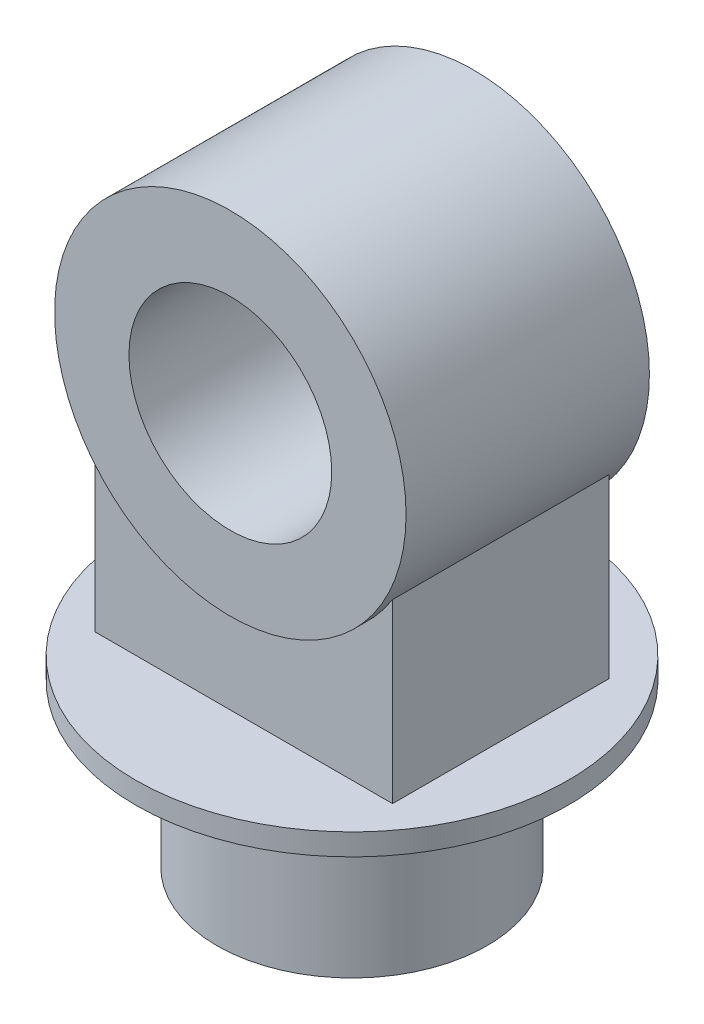
ISO-10303-21;
HEADER;
FILE_DESCRIPTION(('STEP AP214'),'2;1');
FILE_NAME('part.step','',(''),(''),'','','');
FILE_SCHEMA(('AUTOMOTIVE_DESIGN { 1 0 10303 214 1 1 1 1 }'));
ENDSEC;
DATA;
#1=APPLICATION_CONTEXT('core data for automotive mechanical design processes');
#2=APPLICATION_PROTOCOL_DEFINITION('international standard','automotive_design',2000,#1);
#3=PRODUCT_CONTEXT('',#1,'mechanical');
#4=PRODUCT('Part','Part','',(#3));
#5=PRODUCT_RELATED_PRODUCT_CATEGORY('part','',(#4));
#6=PRODUCT_DEFINITION_FORMATION('','',#4);
#7=PRODUCT_DEFINITION_CONTEXT('part definition',#1,'design');
#8=PRODUCT_DEFINITION('design','',#6,#7);
#9=PRODUCT_DEFINITION_SHAPE('','',#8);
#10=(LENGTH_UNIT() NAMED_UNIT(*) SI_UNIT(.MILLI.,.METRE.));
#11=(NAMED_UNIT(*) PLANE_ANGLE_UNIT() SI_UNIT($,.RADIAN.));
#12=(NAMED_UNIT(*) SI_UNIT($,.STERADIAN.) SOLID_ANGLE_UNIT());
#13=UNCERTAINTY_MEASURE_WITH_UNIT(LENGTH_MEASURE(1.E-05),#10,'distance_accuracy_value','');
#14=(GEOMETRIC_REPRESENTATION_CONTEXT(3) GLOBAL_UNCERTAINTY_ASSIGNED_CONTEXT((#13)) GLOBAL_UNIT_ASSIGNED_CONTEXT((#10,
#11,#12)) REPRESENTATION_CONTEXT('',''));
#15=CARTESIAN_POINT('',(0.,0.,0.));
#16=DIRECTION('',(0.,0.,1.));
#17=DIRECTION('',(1.,0.,0.));
#18=AXIS2_PLACEMENT_3D('',#15,#16,#17);
#19=CARTESIAN_POINT('',(0.,120.,0.));
#20=DIRECTION('',(0.,-1.,0.));
#21=DIRECTION('',(0.,0.,-1.));
#22=AXIS2_PLACEMENT_3D('',#19,#20,#21);
#23=CYLINDRICAL_SURFACE('',#22,100.);
#24=CARTESIAN_POINT('',(0.,120.,0.));
#25=DIRECTION('',(0.,1.,0.));
#26=DIRECTION('',(0.,0.,1.));
#27=AXIS2_PLACEMENT_3D('',#24,#25,#26);
#28=CIRCLE('',#27,100.);
#29=CARTESIAN_POINT('',(0.,120.,100.));
#30=VERTEX_POINT('',#29);
#31=EDGE_CURVE('E11',#30,#30,#28,.T.);
#32=ORIENTED_EDGE('',*,*,#31,.F.);
#33=EDGE_LOOP('',(#32));
#34=FACE_BOUND('',#33,.T.);
#35=CARTESIAN_POINT('',(0.,0.,0.));
#36=DIRECTION('',(0.,1.,0.));
#37=DIRECTION('',(0.,0.,1.));
#38=AXIS2_PLACEMENT_3D('',#35,#36,#37);
#39=CIRCLE('',#38,100.);
#40=CARTESIAN_POINT('',(0.,0.,100.));
#41=VERTEX_POINT('',#40);
#42=EDGE_CURVE('E46',#41,#41,#39,.T.);
#43=ORIENTED_EDGE('',*,*,#42,.T.);
#44=EDGE_LOOP('',(#43));
#45=FACE_BOUND('',#44,.T.);
#46=ADVANCED_FACE('F43',(#34,#45),#23,.T.);
#47=CARTESIAN_POINT('',(0.,0.,0.));
#48=DIRECTION('',(0.,1.,0.));
#49=DIRECTION('',(0.,0.,1.));
#50=AXIS2_PLACEMENT_3D('',#47,#48,#49);
#51=PLANE('',#50);
#52=ORIENTED_EDGE('',*,*,#42,.F.);
#53=EDGE_LOOP('',(#52));
#54=FACE_BOUND('',#53,.T.);
#55=ADVANCED_FACE('F147',(#54),#51,.F.);
#56=CARTESIAN_POINT('',(0.,136.,0.));
#57=DIRECTION('',(0.,-1.,0.));
#58=DIRECTION('',(0.,0.,-1.));
#59=AXIS2_PLACEMENT_3D('',#56,#57,#58);
#60=CYLINDRICAL_SURFACE('',#59,160.);
#61=CARTESIAN_POINT('',(0.,136.,0.));
#62=DIRECTION('',(0.,1.,0.));
#63=DIRECTION('',(0.,0.,1.));
#64=AXIS2_PLACEMENT_3D('',#61,#62,#63);
#65=CIRCLE('',#64,160.);
#66=CARTESIAN_POINT('',(0.,136.,160.));
#67=VERTEX_POINT('',#66);
#68=EDGE_CURVE('E111',#67,#67,#65,.T.);
#69=ORIENTED_EDGE('',*,*,#68,.F.);
#70=EDGE_LOOP('',(#69));
#71=FACE_BOUND('',#70,.T.);
#72=CARTESIAN_POINT('',(0.,120.,0.));
#73=DIRECTION('',(0.,1.,0.));
#74=DIRECTION('',(0.,0.,1.));
#75=AXIS2_PLACEMENT_3D('',#72,#73,#74);
#76=CIRCLE('',#75,160.);
#77=CARTESIAN_POINT('',(0.,120.,160.));
#78=VERTEX_POINT('',#77);
#79=EDGE_CURVE('E114',#78,#78,#76,.T.);
#80=ORIENTED_EDGE('',*,*,#79,.T.);
#81=EDGE_LOOP('',(#80));
#82=FACE_BOUND('',#81,.T.);
#83=ADVANCED_FACE('F142',(#71,#82),#60,.T.);
#84=CARTESIAN_POINT('',(0.,136.,0.));
#85=DIRECTION('',(0.,1.,0.));
#86=DIRECTION('',(0.,0.,1.));
#87=AXIS2_PLACEMENT_3D('',#84,#85,#86);
#88=PLANE('',#87);
#89=DIRECTION('',(0.,0.,-1.));
#90=VECTOR('',#89,1.);
#91=CARTESIAN_POINT('',(110.,136.,-80.));
#92=LINE('',#91,#90);
#93=CARTESIAN_POINT('',(110.,136.,80.));
#94=VERTEX_POINT('',#93);
#95=CARTESIAN_POINT('',(110.,136.,-80.));
#96=VERTEX_POINT('',#95);
#97=EDGE_CURVE('E57',#94,#96,#92,.T.);
#98=ORIENTED_EDGE('',*,*,#97,.F.);
#99=DIRECTION('',(1.,0.,0.));
#100=VECTOR('',#99,1.);
#101=CARTESIAN_POINT('',(-110.,136.,80.));
#102=LINE('',#101,#100);
#103=CARTESIAN_POINT('',(-110.,136.,80.));
#104=VERTEX_POINT('',#103);
#105=EDGE_CURVE('E62',#104,#94,#102,.T.);
#106=ORIENTED_EDGE('',*,*,#105,.F.);
#107=DIRECTION('',(0.,0.,1.));
#108=VECTOR('',#107,1.);
#109=CARTESIAN_POINT('',(-110.,136.,-80.));
#110=LINE('',#109,#108);
#111=CARTESIAN_POINT('',(-110.,136.,-80.));
#112=VERTEX_POINT('',#111);
#113=EDGE_CURVE('E119',#112,#104,#110,.T.);
#114=ORIENTED_EDGE('',*,*,#113,.F.);
#115=DIRECTION('',(-1.,0.,0.));
#116=VECTOR('',#115,1.);
#117=CARTESIAN_POINT('',(-110.,136.,-80.));
#118=LINE('',#117,#116);
#119=EDGE_CURVE('E87',#96,#112,#118,.T.);
#120=ORIENTED_EDGE('',*,*,#119,.F.);
#121=EDGE_LOOP('',(#98,#106,#114,#120));
#122=FACE_BOUND('',#121,.T.);
#123=ORIENTED_EDGE('',*,*,#68,.T.);
#124=EDGE_LOOP('',(#123));
#125=FACE_BOUND('',#124,.T.);
#126=ADVANCED_FACE('F138',(#122,#125),#88,.T.);
#127=CARTESIAN_POINT('',(0.,120.,0.));
#128=DIRECTION('',(0.,1.,0.));
#129=DIRECTION('',(0.,0.,1.));
#130=AXIS2_PLACEMENT_3D('',#127,#128,#129);
#131=PLANE('',#130);
#132=ORIENTED_EDGE('',*,*,#31,.T.);
#133=EDGE_LOOP('',(#132));
#134=FACE_BOUND('',#133,.T.);
#135=ORIENTED_EDGE('',*,*,#79,.F.);
#136=EDGE_LOOP('',(#135));
#137=FACE_BOUND('',#136,.T.);
#138=ADVANCED_FACE('F141',(#134,#137),#131,.F.);
#139=CARTESIAN_POINT('',(-110.,466.002,-80.));
#140=DIRECTION('',(0.,0.,1.));
#141=DIRECTION('',(1.,0.,0.));
#142=AXIS2_PLACEMENT_3D('',#139,#140,#141);
#143=PLANE('',#142);
#144=CARTESIAN_POINT('',(0.,336.,-80.));
#145=DIRECTION('',(0.,0.,1.));
#146=DIRECTION('',(1.,0.,0.));
#147=AXIS2_PLACEMENT_3D('',#144,#145,#146);
#148=CIRCLE('',#147,130.);
#149=CARTESIAN_POINT('',(110.,266.717967697245,-80.));
#150=VERTEX_POINT('',#149);
#151=CARTESIAN_POINT('',(-110.,266.717967697245,-80.));
#152=VERTEX_POINT('',#151);
#153=EDGE_CURVE('E98',#150,#152,#148,.F.);
#154=ORIENTED_EDGE('',*,*,#153,.F.);
#155=DIRECTION('',(0.,-1.,0.));
#156=VECTOR('',#155,1.);
#157=CARTESIAN_POINT('',(110.,466.002,-80.));
#158=LINE('',#157,#156);
#159=EDGE_CURVE('E95',#150,#96,#158,.T.);
#160=ORIENTED_EDGE('',*,*,#159,.T.);
#161=ORIENTED_EDGE('',*,*,#119,.T.);
#162=DIRECTION('',(0.,-1.,0.));
#163=VECTOR('',#162,1.);
#164=CARTESIAN_POINT('',(-110.,466.002,-80.));
#165=LINE('',#164,#163);
#166=EDGE_CURVE('E130',#152,#112,#165,.T.);
#167=ORIENTED_EDGE('',*,*,#166,.F.);
#168=EDGE_LOOP('',(#154,#160,#161,#167));
#169=FACE_BOUND('',#168,.T.);
#170=ADVANCED_FACE('F135',(#169),#143,.F.);
#171=CARTESIAN_POINT('',(110.,466.002,-80.));
#172=DIRECTION('',(-1.,0.,0.));
#173=DIRECTION('',(0.,0.,1.));
#174=AXIS2_PLACEMENT_3D('',#171,#172,#173);
#175=PLANE('',#174);
#176=DIRECTION('',(0.,0.,-1.));
#177=VECTOR('',#176,1.);
#178=CARTESIAN_POINT('',(110.,266.717967697245,90.));
#179=LINE('',#178,#177);
#180=CARTESIAN_POINT('',(110.,266.717967697245,80.));
#181=VERTEX_POINT('',#180);
#182=EDGE_CURVE('E92',#181,#150,#179,.T.);
#183=ORIENTED_EDGE('',*,*,#182,.F.);
#184=DIRECTION('',(0.,-1.,0.));
#185=VECTOR('',#184,1.);
#186=CARTESIAN_POINT('',(110.,466.002,80.));
#187=LINE('',#186,#185);
#188=EDGE_CURVE('E80',#181,#94,#187,.T.);
#189=ORIENTED_EDGE('',*,*,#188,.T.);
#190=ORIENTED_EDGE('',*,*,#97,.T.);
#191=ORIENTED_EDGE('',*,*,#159,.F.);
#192=EDGE_LOOP('',(#183,#189,#190,#191));
#193=FACE_BOUND('',#192,.T.);
#194=ADVANCED_FACE('F93',(#193),#175,.F.);
#195=CARTESIAN_POINT('',(-110.,466.002,-80.));
#196=DIRECTION('',(1.,0.,0.));
#197=DIRECTION('',(0.,0.,-1.));
#198=AXIS2_PLACEMENT_3D('',#195,#196,#197);
#199=PLANE('',#198);
#200=DIRECTION('',(0.,0.,-1.));
#201=VECTOR('',#200,1.);
#202=CARTESIAN_POINT('',(-110.,266.717967697245,90.));
#203=LINE('',#202,#201);
#204=CARTESIAN_POINT('',(-110.,266.717967697245,80.));
#205=VERTEX_POINT('',#204);
#206=EDGE_CURVE('E102',#152,#205,#203,.F.);
#207=ORIENTED_EDGE('',*,*,#206,.F.);
#208=ORIENTED_EDGE('',*,*,#166,.T.);
#209=ORIENTED_EDGE('',*,*,#113,.T.);
#210=DIRECTION('',(0.,-1.,0.));
#211=VECTOR('',#210,1.);
#212=CARTESIAN_POINT('',(-110.,466.002,80.));
#213=LINE('',#212,#211);
#214=EDGE_CURVE('E88',#205,#104,#213,.T.);
#215=ORIENTED_EDGE('',*,*,#214,.F.);
#216=EDGE_LOOP('',(#207,#208,#209,#215));
#217=FACE_BOUND('',#216,.T.);
#218=ADVANCED_FACE('F137',(#217),#199,.F.);
#219=CARTESIAN_POINT('',(-110.,466.002,80.));
#220=DIRECTION('',(0.,0.,-1.));
#221=DIRECTION('',(-1.,0.,0.));
#222=AXIS2_PLACEMENT_3D('',#219,#220,#221);
#223=PLANE('',#222);
#224=CARTESIAN_POINT('',(0.,336.,80.));
#225=DIRECTION('',(0.,0.,-1.));
#226=DIRECTION('',(-1.,0.,0.));
#227=AXIS2_PLACEMENT_3D('',#224,#225,#226);
#228=CIRCLE('',#227,130.);
#229=EDGE_CURVE('E84',#205,#181,#228,.F.);
#230=ORIENTED_EDGE('',*,*,#229,.F.);
#231=ORIENTED_EDGE('',*,*,#214,.T.);
#232=ORIENTED_EDGE('',*,*,#105,.T.);
#233=ORIENTED_EDGE('',*,*,#188,.F.);
#234=EDGE_LOOP('',(#230,#231,#232,#233));
#235=FACE_BOUND('',#234,.T.);
#236=ADVANCED_FACE('F82',(#235),#223,.F.);
#237=CARTESIAN_POINT('',(0.,336.,90.));
#238=DIRECTION('',(0.,0.,-1.));
#239=DIRECTION('',(-1.,0.,0.));
#240=AXIS2_PLACEMENT_3D('',#237,#238,#239);
#241=CYLINDRICAL_SURFACE('',#240,130.);
#242=CARTESIAN_POINT('',(0.,336.,90.));
#243=DIRECTION('',(0.,0.,1.));
#244=DIRECTION('',(1.,0.,0.));
#245=AXIS2_PLACEMENT_3D('',#242,#243,#244);
#246=CIRCLE('',#245,130.);
#247=CARTESIAN_POINT('',(130.,336.,90.));
#248=VERTEX_POINT('',#247);
#249=EDGE_CURVE('E107',#248,#248,#246,.T.);
#250=ORIENTED_EDGE('',*,*,#249,.F.);
#251=EDGE_LOOP('',(#250));
#252=FACE_BOUND('',#251,.T.);
#253=CARTESIAN_POINT('',(0.,336.,-90.));
#254=DIRECTION('',(0.,0.,1.));
#255=DIRECTION('',(1.,0.,0.));
#256=AXIS2_PLACEMENT_3D('',#253,#254,#255);
#257=CIRCLE('',#256,130.);
#258=CARTESIAN_POINT('',(130.,336.,-90.));
#259=VERTEX_POINT('',#258);
#260=EDGE_CURVE('E200',#259,#259,#257,.T.);
#261=ORIENTED_EDGE('',*,*,#260,.T.);
#262=EDGE_LOOP('',(#261));
#263=FACE_BOUND('',#262,.T.);
#264=ORIENTED_EDGE('',*,*,#182,.T.);
#265=ORIENTED_EDGE('',*,*,#153,.T.);
#266=ORIENTED_EDGE('',*,*,#206,.T.);
#267=ORIENTED_EDGE('',*,*,#229,.T.);
#268=EDGE_LOOP('',(#264,#265,#266,#267));
#269=FACE_BOUND('',#268,.T.);
#270=ADVANCED_FACE('F101',(#252,#263,#269),#241,.T.);
#271=CARTESIAN_POINT('',(0.,336.,90.));
#272=DIRECTION('',(0.,0.,-1.));
#273=DIRECTION('',(-1.,0.,0.));
#274=AXIS2_PLACEMENT_3D('',#271,#272,#273);
#275=CYLINDRICAL_SURFACE('',#274,75.);
#276=CARTESIAN_POINT('',(0.,336.,90.));
#277=DIRECTION('',(0.,0.,1.));
#278=DIRECTION('',(1.,0.,0.));
#279=AXIS2_PLACEMENT_3D('',#276,#277,#278);
#280=CIRCLE('',#279,75.);
#281=CARTESIAN_POINT('',(-75.,336.,90.));
#282=VERTEX_POINT('',#281);
#283=EDGE_CURVE('E103',#282,#282,#280,.T.);
#284=CARTESIAN_POINT('',(0.,336.,-90.));
#285=DIRECTION('',(0.,0.,1.));
#286=DIRECTION('',(1.,0.,0.));
#287=AXIS2_PLACEMENT_3D('',#284,#285,#286);
#288=CIRCLE('',#287,75.);
#289=CARTESIAN_POINT('',(-75.,336.,-90.));
#290=VERTEX_POINT('',#289);
#291=EDGE_CURVE('E123',#290,#290,#288,.T.);
#292=CARTESIAN_POINT('',(-75.,336.,90.));
#293=CARTESIAN_POINT('',(-75.,336.,88.125));
#294=CARTESIAN_POINT('',(-75.,336.,86.25));
#295=CARTESIAN_POINT('',(-75.,336.,82.5));
#296=CARTESIAN_POINT('',(-75.,336.,80.625));
#297=CARTESIAN_POINT('',(-75.,336.,76.875));
#298=CARTESIAN_POINT('',(-75.,336.,75.));
#299=CARTESIAN_POINT('',(-75.,336.,71.25));
#300=CARTESIAN_POINT('',(-75.,336.,69.375));
#301=CARTESIAN_POINT('',(-75.,336.,65.625));
#302=CARTESIAN_POINT('',(-75.,336.,63.75));
#303=CARTESIAN_POINT('',(-75.,336.,60.));
#304=CARTESIAN_POINT('',(-75.,336.,58.125));
#305=CARTESIAN_POINT('',(-75.,336.,54.375));
#306=CARTESIAN_POINT('',(-75.,336.,52.5));
#307=CARTESIAN_POINT('',(-75.,336.,48.75));
#308=CARTESIAN_POINT('',(-75.,336.,46.875));
#309=CARTESIAN_POINT('',(-75.,336.,43.125));
#310=CARTESIAN_POINT('',(-75.,336.,41.25));
#311=CARTESIAN_POINT('',(-75.,336.,37.5));
#312=CARTESIAN_POINT('',(-75.,336.,35.625));
#313=CARTESIAN_POINT('',(-75.,336.,31.875));
#314=CARTESIAN_POINT('',(-75.,336.,30.));
#315=CARTESIAN_POINT('',(-75.,336.,26.25));
#316=CARTESIAN_POINT('',(-75.,336.,24.375));
#317=CARTESIAN_POINT('',(-75.,336.,20.625));
#318=CARTESIAN_POINT('',(-75.,336.,18.75));
#319=CARTESIAN_POINT('',(-75.,336.,15.));
#320=CARTESIAN_POINT('',(-75.,336.,13.125));
#321=CARTESIAN_POINT('',(-75.,336.,9.37499999999998));
#322=CARTESIAN_POINT('',(-75.,336.,7.49999999999998));
#323=CARTESIAN_POINT('',(-75.,336.,3.74999999999998));
#324=CARTESIAN_POINT('',(-75.,336.,1.87499999999997));
#325=CARTESIAN_POINT('',(-75.,336.,-1.87500000000003));
#326=CARTESIAN_POINT('',(-75.,336.,-3.75000000000003));
#327=CARTESIAN_POINT('',(-75.,336.,-7.50000000000003));
#328=CARTESIAN_POINT('',(-75.,336.,-9.37500000000004));
#329=CARTESIAN_POINT('',(-75.,336.,-13.125));
#330=CARTESIAN_POINT('',(-75.,336.,-15.));
#331=CARTESIAN_POINT('',(-75.,336.,-18.75));
#332=CARTESIAN_POINT('',(-75.,336.,-20.625));
#333=CARTESIAN_POINT('',(-75.,336.,-24.375));
#334=CARTESIAN_POINT('',(-75.,336.,-26.25));
#335=CARTESIAN_POINT('',(-75.,336.,-30.));
#336=CARTESIAN_POINT('',(-75.,336.,-31.875));
#337=CARTESIAN_POINT('',(-75.,336.,-35.625));
#338=CARTESIAN_POINT('',(-75.,336.,-37.5));
#339=CARTESIAN_POINT('',(-75.,336.,-41.25));
#340=CARTESIAN_POINT('',(-75.,336.,-43.125));
#341=CARTESIAN_POINT('',(-75.,336.,-46.875));
#342=CARTESIAN_POINT('',(-75.,336.,-48.75));
#343=CARTESIAN_POINT('',(-75.,336.,-52.5));
#344=CARTESIAN_POINT('',(-75.,336.,-54.375));
#345=CARTESIAN_POINT('',(-75.,336.,-58.125));
#346=CARTESIAN_POINT('',(-75.,336.,-60.));
#347=CARTESIAN_POINT('',(-75.,336.,-63.75));
#348=CARTESIAN_POINT('',(-75.,336.,-65.625));
#349=CARTESIAN_POINT('',(-75.,336.,-69.375));
#350=CARTESIAN_POINT('',(-75.,336.,-71.25));
#351=CARTESIAN_POINT('',(-75.,336.,-75.));
#352=CARTESIAN_POINT('',(-75.,336.,-76.875));
#353=CARTESIAN_POINT('',(-75.,336.,-80.625));
#354=CARTESIAN_POINT('',(-75.,336.,-82.5));
#355=CARTESIAN_POINT('',(-75.,336.,-86.25));
#356=CARTESIAN_POINT('',(-75.,336.,-88.125));
#357=CARTESIAN_POINT('',(-75.,336.,-90.));
#358=B_SPLINE_CURVE_WITH_KNOTS('',3,(#292,#293,#294,#295,#296,#297,#298,#299,#300,#301,#302,
#303,#304,#305,#306,#307,#308,#309,#310,#311,#312,#313,#314,#315,#316,#317,#318,#319,#320,#321,
#322,#323,#324,#325,#326,#327,#328,#329,#330,#331,#332,#333,#334,#335,#336,#337,#338,#339,#340,
#341,#342,#343,#344,#345,#346,#347,#348,#349,#350,#351,#352,#353,#354,#355,#356,#357),
.UNSPECIFIED.,.F.,.F.,(4,2,2,2,2,2,2,2,2,2,2,2,2,2,2,2,2,2,2,2,2,2,2,2,2,2,2,2,2,2,2,2,4),(0.,
5.62499999999999,11.25,16.875,22.5,28.125,33.75,39.375,45.,50.625,56.25,61.875,67.5,73.125,
78.75,84.375,90.,95.625,101.25,106.875,112.5,118.125,123.75,129.375,135.,140.625,146.25,151.875,
157.5,163.125,168.75,174.375,180.),.UNSPECIFIED.);
#359=EDGE_CURVE('BSEAM178',#282,#290,#358,.T.);
#360=ORIENTED_EDGE('',*,*,#283,.T.);
#361=ORIENTED_EDGE('',*,*,#291,.F.);
#362=ORIENTED_EDGE('',*,*,#359,.T.);
#363=ORIENTED_EDGE('',*,*,#359,.F.);
#364=EDGE_LOOP('',(#360,#362,#361,#363));
#365=FACE_BOUND('',#364,.T.);
#366=ADVANCED_FACE('F178',(#365),#275,.F.);
#367=CARTESIAN_POINT('',(0.,0.,90.));
#368=DIRECTION('',(0.,0.,1.));
#369=DIRECTION('',(1.,0.,0.));
#370=AXIS2_PLACEMENT_3D('',#367,#368,#369);
#371=PLANE('',#370);
#372=ORIENTED_EDGE('',*,*,#249,.T.);
#373=EDGE_LOOP('',(#372));
#374=FACE_BOUND('',#373,.T.);
#375=ORIENTED_EDGE('',*,*,#283,.F.);
#376=EDGE_LOOP('',(#375));
#377=FACE_BOUND('',#376,.T.);
#378=ADVANCED_FACE('F182',(#374,#377),#371,.T.);
#379=CARTESIAN_POINT('',(0.,0.,-90.));
#380=DIRECTION('',(0.,0.,1.));
#381=DIRECTION('',(1.,0.,0.));
#382=AXIS2_PLACEMENT_3D('',#379,#380,#381);
#383=PLANE('',#382);
#384=ORIENTED_EDGE('',*,*,#260,.F.);
#385=EDGE_LOOP('',(#384));
#386=FACE_BOUND('',#385,.T.);
#387=ORIENTED_EDGE('',*,*,#291,.T.);
#388=EDGE_LOOP('',(#387));
#389=FACE_BOUND('',#388,.T.);
#390=ADVANCED_FACE('F184',(#386,#389),#383,.F.);
#391=CLOSED_SHELL('',(#46,#55,#83,#126,#138,#170,#194,#218,#236,#270,#366,#378,#390));
#392=MANIFOLD_SOLID_BREP('B2',#391);
#393=ADVANCED_BREP_SHAPE_REPRESENTATION('',(#18,#392),#14);
#394=SHAPE_DEFINITION_REPRESENTATION(#9,#393);
ENDSEC;
END-ISO-10303-21;
